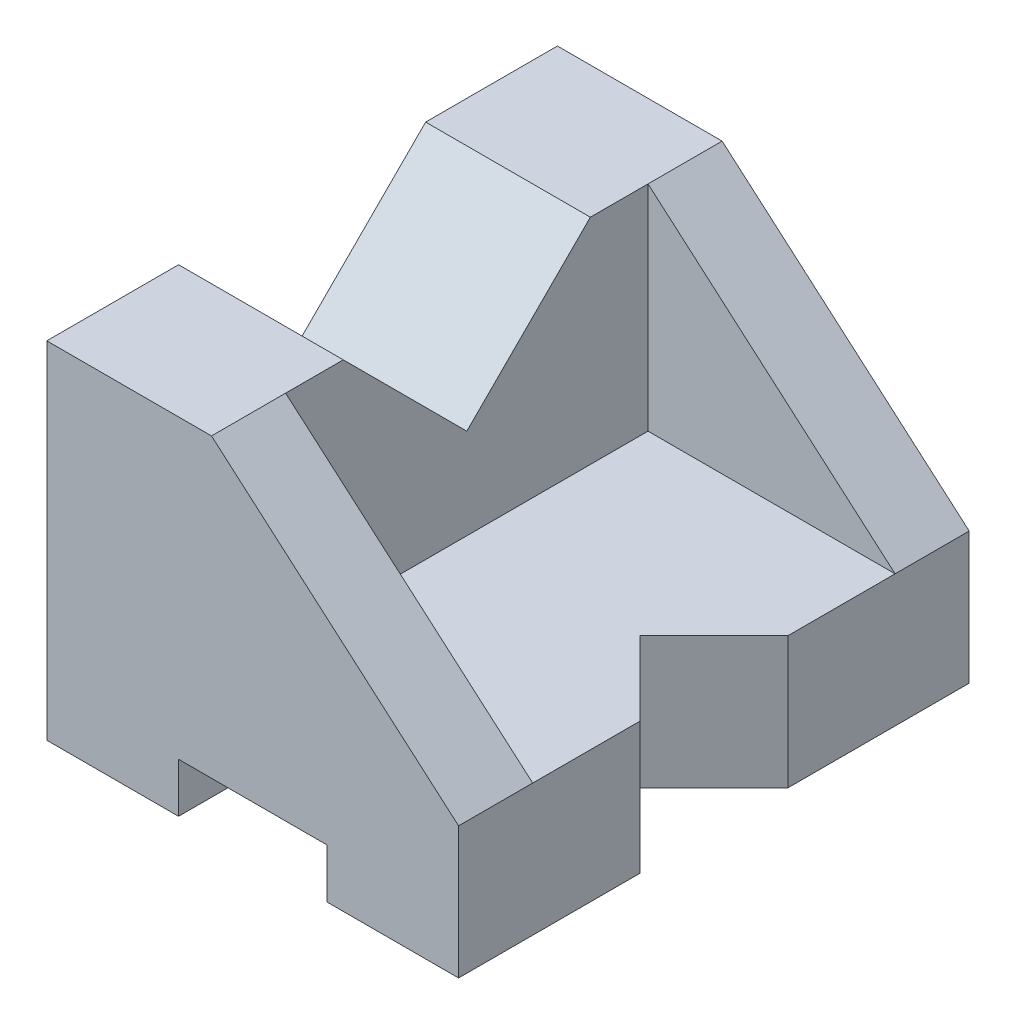
ISO-10303-21;
HEADER;
FILE_DESCRIPTION(('STEP AP214'),'2;1');
FILE_NAME('part.step','',(''),(''),'','','');
FILE_SCHEMA(('AUTOMOTIVE_DESIGN { 1 0 10303 214 1 1 1 1 }'));
ENDSEC;
DATA;
#1=APPLICATION_CONTEXT('core data for automotive mechanical design processes');
#2=APPLICATION_PROTOCOL_DEFINITION('international standard','automotive_design',2000,#1);
#3=PRODUCT_CONTEXT('',#1,'mechanical');
#4=PRODUCT('Part','Part','',(#3));
#5=PRODUCT_RELATED_PRODUCT_CATEGORY('part','',(#4));
#6=PRODUCT_DEFINITION_FORMATION('','',#4);
#7=PRODUCT_DEFINITION_CONTEXT('part definition',#1,'design');
#8=PRODUCT_DEFINITION('design','',#6,#7);
#9=PRODUCT_DEFINITION_SHAPE('','',#8);
#10=(LENGTH_UNIT() NAMED_UNIT(*) SI_UNIT(.MILLI.,.METRE.));
#11=(NAMED_UNIT(*) PLANE_ANGLE_UNIT() SI_UNIT($,.RADIAN.));
#12=(NAMED_UNIT(*) SI_UNIT($,.STERADIAN.) SOLID_ANGLE_UNIT());
#13=UNCERTAINTY_MEASURE_WITH_UNIT(LENGTH_MEASURE(1.E-05),#10,'distance_accuracy_value','');
#14=(GEOMETRIC_REPRESENTATION_CONTEXT(3) GLOBAL_UNCERTAINTY_ASSIGNED_CONTEXT((#13)) GLOBAL_UNIT_ASSIGNED_CONTEXT((#10,
#11,#12)) REPRESENTATION_CONTEXT('',''));
#15=CARTESIAN_POINT('',(0.,0.,0.));
#16=DIRECTION('',(0.,0.,1.));
#17=DIRECTION('',(1.,0.,0.));
#18=AXIS2_PLACEMENT_3D('',#15,#16,#17);
#19=CARTESIAN_POINT('',(25.,0.,31.));
#20=DIRECTION('',(-1.,0.,0.));
#21=DIRECTION('',(0.,-1.,0.));
#22=AXIS2_PLACEMENT_3D('',#19,#20,#21);
#23=PLANE('',#22);
#24=DIRECTION('',(0.,-1.,0.));
#25=VECTOR('',#24,1.);
#26=CARTESIAN_POINT('',(25.,155.055541844904,9.));
#27=LINE('',#26,#25);
#28=CARTESIAN_POINT('',(25.,10.,9.));
#29=VERTEX_POINT('',#28);
#30=CARTESIAN_POINT('',(25.,-6.,9.));
#31=VERTEX_POINT('',#30);
#32=EDGE_CURVE('E178',#29,#31,#27,.T.);
#33=ORIENTED_EDGE('',*,*,#32,.F.);
#34=DIRECTION('',(0.,0.,-1.));
#35=VECTOR('',#34,1.);
#36=CARTESIAN_POINT('',(25.,10.,31.));
#37=LINE('',#36,#35);
#38=CARTESIAN_POINT('',(25.,10.,22.));
#39=VERTEX_POINT('',#38);
#40=EDGE_CURVE('E265',#39,#29,#37,.T.);
#41=ORIENTED_EDGE('',*,*,#40,.F.);
#42=CARTESIAN_POINT('',(25.,10.,31.));
#43=VERTEX_POINT('',#42);
#44=EDGE_CURVE('E262',#43,#39,#37,.T.);
#45=ORIENTED_EDGE('',*,*,#44,.F.);
#46=DIRECTION('',(0.,1.,0.));
#47=VECTOR('',#46,1.);
#48=CARTESIAN_POINT('',(25.,0.,31.));
#49=LINE('',#48,#47);
#50=CARTESIAN_POINT('',(25.,-6.,31.));
#51=VERTEX_POINT('',#50);
#52=EDGE_CURVE('E242',#51,#43,#49,.T.);
#53=ORIENTED_EDGE('',*,*,#52,.F.);
#54=DIRECTION('',(0.,0.,-1.));
#55=VECTOR('',#54,1.);
#56=CARTESIAN_POINT('',(25.,-6.,31.));
#57=LINE('',#56,#55);
#58=EDGE_CURVE('E266',#51,#31,#57,.T.);
#59=ORIENTED_EDGE('',*,*,#58,.T.);
#60=EDGE_LOOP('',(#33,#41,#45,#53,#59));
#61=FACE_BOUND('',#60,.T.);
#62=ADVANCED_FACE('F41',(#61),#23,.F.);
#63=CARTESIAN_POINT('',(0.,10.,31.));
#64=DIRECTION('',(0.,1.,0.));
#65=DIRECTION('',(0.,0.,1.));
#66=AXIS2_PLACEMENT_3D('',#63,#64,#65);
#67=PLANE('',#66);
#68=DIRECTION('',(-0.707106781186548,0.,-0.707106781186547));
#69=VECTOR('',#68,1.);
#70=CARTESIAN_POINT('',(23.5,10.,7.49999999999999));
#71=LINE('',#70,#69);
#72=CARTESIAN_POINT('',(16.,10.,0.));
#73=VERTEX_POINT('',#72);
#74=EDGE_CURVE('E56',#29,#73,#71,.T.);
#75=ORIENTED_EDGE('',*,*,#74,.T.);
#76=DIRECTION('',(0.707106781186548,0.,-0.707106781186548));
#77=VECTOR('',#76,1.);
#78=CARTESIAN_POINT('',(-7.5,10.,23.5));
#79=LINE('',#78,#77);
#80=CARTESIAN_POINT('',(25.,10.,-9.));
#81=VERTEX_POINT('',#80);
#82=EDGE_CURVE('E60',#73,#81,#79,.T.);
#83=ORIENTED_EDGE('',*,*,#82,.T.);
#84=CARTESIAN_POINT('',(25.,10.,-22.));
#85=VERTEX_POINT('',#84);
#86=EDGE_CURVE('E245',#81,#85,#37,.T.);
#87=ORIENTED_EDGE('',*,*,#86,.T.);
#88=DIRECTION('',(1.,0.,0.));
#89=VECTOR('',#88,1.);
#90=CARTESIAN_POINT('',(0.,10.,-22.));
#91=LINE('',#90,#89);
#92=CARTESIAN_POINT('',(-5.,10.,-22.));
#93=VERTEX_POINT('',#92);
#94=EDGE_CURVE('E206',#93,#85,#91,.T.);
#95=ORIENTED_EDGE('',*,*,#94,.F.);
#96=DIRECTION('',(0.,0.,-1.));
#97=VECTOR('',#96,1.);
#98=CARTESIAN_POINT('',(-5.,10.,31.));
#99=LINE('',#98,#97);
#100=CARTESIAN_POINT('',(-5.,10.,22.));
#101=VERTEX_POINT('',#100);
#102=EDGE_CURVE('E291',#101,#93,#99,.T.);
#103=ORIENTED_EDGE('',*,*,#102,.F.);
#104=DIRECTION('',(1.,0.,0.));
#105=VECTOR('',#104,1.);
#106=CARTESIAN_POINT('',(0.,10.,22.));
#107=LINE('',#106,#105);
#108=EDGE_CURVE('E223',#101,#39,#107,.T.);
#109=ORIENTED_EDGE('',*,*,#108,.T.);
#110=ORIENTED_EDGE('',*,*,#40,.T.);
#111=EDGE_LOOP('',(#75,#83,#87,#95,#103,#109,#110));
#112=FACE_BOUND('',#111,.T.);
#113=ADVANCED_FACE('F43',(#112),#67,.T.);
#114=CARTESIAN_POINT('',(0.,-6.,31.));
#115=DIRECTION('',(0.,1.,0.));
#116=DIRECTION('',(-1.,0.,0.));
#117=AXIS2_PLACEMENT_3D('',#114,#115,#116);
#118=PLANE('',#117);
#119=DIRECTION('',(0.707106781186548,0.,-0.707106781186548));
#120=VECTOR('',#119,1.);
#121=CARTESIAN_POINT('',(-7.5,-6.,23.5));
#122=LINE('',#121,#120);
#123=CARTESIAN_POINT('',(16.,-5.99999999999995,0.));
#124=VERTEX_POINT('',#123);
#125=CARTESIAN_POINT('',(25.,-6.,-9.));
#126=VERTEX_POINT('',#125);
#127=EDGE_CURVE('E11',#124,#126,#122,.T.);
#128=ORIENTED_EDGE('',*,*,#127,.F.);
#129=DIRECTION('',(-0.707106781186548,0.,-0.707106781186547));
#130=VECTOR('',#129,1.);
#131=CARTESIAN_POINT('',(23.5,-6.,7.49999999999999));
#132=LINE('',#131,#130);
#133=EDGE_CURVE('E49',#31,#124,#132,.T.);
#134=ORIENTED_EDGE('',*,*,#133,.F.);
#135=ORIENTED_EDGE('',*,*,#58,.F.);
#136=DIRECTION('',(1.,0.,0.));
#137=VECTOR('',#136,1.);
#138=CARTESIAN_POINT('',(0.,-6.,31.));
#139=LINE('',#138,#137);
#140=CARTESIAN_POINT('',(8.99999999999999,-6.,31.));
#141=VERTEX_POINT('',#140);
#142=EDGE_CURVE('E240',#141,#51,#139,.T.);
#143=ORIENTED_EDGE('',*,*,#142,.F.);
#144=DIRECTION('',(0.,0.,-1.));
#145=VECTOR('',#144,1.);
#146=CARTESIAN_POINT('',(8.99999999999999,-6.,31.));
#147=LINE('',#146,#145);
#148=CARTESIAN_POINT('',(8.99999999999999,-6.,-31.));
#149=VERTEX_POINT('',#148);
#150=EDGE_CURVE('E268',#141,#149,#147,.T.);
#151=ORIENTED_EDGE('',*,*,#150,.T.);
#152=DIRECTION('',(1.,0.,0.));
#153=VECTOR('',#152,1.);
#154=CARTESIAN_POINT('',(0.,-6.,-31.));
#155=LINE('',#154,#153);
#156=CARTESIAN_POINT('',(25.,-6.,-31.));
#157=VERTEX_POINT('',#156);
#158=EDGE_CURVE('E258',#149,#157,#155,.T.);
#159=ORIENTED_EDGE('',*,*,#158,.T.);
#160=EDGE_CURVE('E169',#126,#157,#57,.T.);
#161=ORIENTED_EDGE('',*,*,#160,.F.);
#162=EDGE_LOOP('',(#128,#134,#135,#143,#151,#159,#161));
#163=FACE_BOUND('',#162,.T.);
#164=ADVANCED_FACE('F165',(#163),#118,.F.);
#165=CARTESIAN_POINT('',(0.,36.,31.));
#166=DIRECTION('',(0.,-1.,0.));
#167=DIRECTION('',(0.,0.,-1.));
#168=AXIS2_PLACEMENT_3D('',#165,#166,#167);
#169=PLANE('',#168);
#170=DIRECTION('',(-1.,0.,0.));
#171=VECTOR('',#170,1.);
#172=CARTESIAN_POINT('',(107.555541844904,36.,-15.));
#173=LINE('',#172,#171);
#174=CARTESIAN_POINT('',(-5.,36.,-15.));
#175=VERTEX_POINT('',#174);
#176=CARTESIAN_POINT('',(-25.,36.,-15.));
#177=VERTEX_POINT('',#176);
#178=EDGE_CURVE('E189',#175,#177,#173,.T.);
#179=ORIENTED_EDGE('',*,*,#178,.F.);
#180=DIRECTION('',(0.,0.,-1.));
#181=VECTOR('',#180,1.);
#182=CARTESIAN_POINT('',(-5.,36.,31.));
#183=LINE('',#182,#181);
#184=CARTESIAN_POINT('',(-5.,36.,-22.));
#185=VERTEX_POINT('',#184);
#186=EDGE_CURVE('E287',#175,#185,#183,.T.);
#187=ORIENTED_EDGE('',*,*,#186,.T.);
#188=DIRECTION('',(0.,0.,1.));
#189=VECTOR('',#188,1.);
#190=CARTESIAN_POINT('',(-5.,36.,-31.));
#191=LINE('',#190,#189);
#192=CARTESIAN_POINT('',(-5.,36.,-31.));
#193=VERTEX_POINT('',#192);
#194=EDGE_CURVE('E211',#193,#185,#191,.T.);
#195=ORIENTED_EDGE('',*,*,#194,.F.);
#196=DIRECTION('',(-1.,0.,0.));
#197=VECTOR('',#196,1.);
#198=CARTESIAN_POINT('',(0.,36.,-31.));
#199=LINE('',#198,#197);
#200=CARTESIAN_POINT('',(-25.,36.,-31.));
#201=VERTEX_POINT('',#200);
#202=EDGE_CURVE('E220',#193,#201,#199,.T.);
#203=ORIENTED_EDGE('',*,*,#202,.T.);
#204=DIRECTION('',(0.,0.,-1.));
#205=VECTOR('',#204,1.);
#206=CARTESIAN_POINT('',(-25.,36.,31.));
#207=LINE('',#206,#205);
#208=EDGE_CURVE('E283',#177,#201,#207,.T.);
#209=ORIENTED_EDGE('',*,*,#208,.F.);
#210=EDGE_LOOP('',(#179,#187,#195,#203,#209));
#211=FACE_BOUND('',#210,.T.);
#212=ADVANCED_FACE('F314',(#211),#169,.F.);
#213=CARTESIAN_POINT('',(-5.,0.,31.));
#214=DIRECTION('',(1.,0.,0.));
#215=DIRECTION('',(0.,1.,0.));
#216=AXIS2_PLACEMENT_3D('',#213,#214,#215);
#217=PLANE('',#216);
#218=DIRECTION('',(0.,-0.707106781186548,0.707106781186548));
#219=VECTOR('',#218,1.);
#220=CARTESIAN_POINT('',(-4.99999999999999,-5.,26.));
#221=LINE('',#220,#219);
#222=CARTESIAN_POINT('',(-5.,21.,0.));
#223=VERTEX_POINT('',#222);
#224=EDGE_CURVE('E196',#175,#223,#221,.T.);
#225=ORIENTED_EDGE('',*,*,#224,.T.);
#226=DIRECTION('',(0.,0.707106781186548,0.707106781186548));
#227=VECTOR('',#226,1.);
#228=CARTESIAN_POINT('',(-5.,26.,5.));
#229=LINE('',#228,#227);
#230=CARTESIAN_POINT('',(-5.,36.,15.));
#231=VERTEX_POINT('',#230);
#232=EDGE_CURVE('E198',#223,#231,#229,.T.);
#233=ORIENTED_EDGE('',*,*,#232,.T.);
#234=CARTESIAN_POINT('',(-5.,36.,22.));
#235=VERTEX_POINT('',#234);
#236=EDGE_CURVE('E292',#235,#231,#183,.T.);
#237=ORIENTED_EDGE('',*,*,#236,.F.);
#238=DIRECTION('',(0.,-1.,0.));
#239=VECTOR('',#238,1.);
#240=CARTESIAN_POINT('',(-5.,0.,22.));
#241=LINE('',#240,#239);
#242=EDGE_CURVE('E214',#235,#101,#241,.T.);
#243=ORIENTED_EDGE('',*,*,#242,.T.);
#244=ORIENTED_EDGE('',*,*,#102,.T.);
#245=DIRECTION('',(0.,-1.,0.));
#246=VECTOR('',#245,1.);
#247=CARTESIAN_POINT('',(-5.,0.,-22.));
#248=LINE('',#247,#246);
#249=EDGE_CURVE('E200',#185,#93,#248,.T.);
#250=ORIENTED_EDGE('',*,*,#249,.F.);
#251=ORIENTED_EDGE('',*,*,#186,.F.);
#252=EDGE_LOOP('',(#225,#233,#237,#243,#244,#250,#251));
#253=FACE_BOUND('',#252,.T.);
#254=ADVANCED_FACE('F318',(#253),#217,.T.);
#255=CARTESIAN_POINT('',(-25.,0.,31.));
#256=DIRECTION('',(1.,0.,0.));
#257=DIRECTION('',(0.,1.,0.));
#258=AXIS2_PLACEMENT_3D('',#255,#256,#257);
#259=PLANE('',#258);
#260=DIRECTION('',(0.,0.707106781186548,0.707106781186548));
#261=VECTOR('',#260,1.);
#262=CARTESIAN_POINT('',(-25.,26.,5.));
#263=LINE('',#262,#261);
#264=CARTESIAN_POINT('',(-25.,21.,0.));
#265=VERTEX_POINT('',#264);
#266=CARTESIAN_POINT('',(-25.,36.,15.));
#267=VERTEX_POINT('',#266);
#268=EDGE_CURVE('E179',#265,#267,#263,.T.);
#269=ORIENTED_EDGE('',*,*,#268,.F.);
#270=DIRECTION('',(0.,-0.707106781186548,0.707106781186548));
#271=VECTOR('',#270,1.);
#272=CARTESIAN_POINT('',(-25.,-5.,26.));
#273=LINE('',#272,#271);
#274=EDGE_CURVE('E295',#177,#265,#273,.T.);
#275=ORIENTED_EDGE('',*,*,#274,.F.);
#276=ORIENTED_EDGE('',*,*,#208,.T.);
#277=DIRECTION('',(0.,-1.,0.));
#278=VECTOR('',#277,1.);
#279=CARTESIAN_POINT('',(-25.,0.,-31.));
#280=LINE('',#279,#278);
#281=CARTESIAN_POINT('',(-25.,-6.,-31.));
#282=VERTEX_POINT('',#281);
#283=EDGE_CURVE('E248',#201,#282,#280,.T.);
#284=ORIENTED_EDGE('',*,*,#283,.T.);
#285=DIRECTION('',(0.,0.,-1.));
#286=VECTOR('',#285,1.);
#287=CARTESIAN_POINT('',(-25.,-6.,31.));
#288=LINE('',#287,#286);
#289=CARTESIAN_POINT('',(-25.,-6.,31.));
#290=VERTEX_POINT('',#289);
#291=EDGE_CURVE('E280',#290,#282,#288,.T.);
#292=ORIENTED_EDGE('',*,*,#291,.F.);
#293=DIRECTION('',(0.,-1.,0.));
#294=VECTOR('',#293,1.);
#295=CARTESIAN_POINT('',(-25.,0.,31.));
#296=LINE('',#295,#294);
#297=CARTESIAN_POINT('',(-25.,36.,31.));
#298=VERTEX_POINT('',#297);
#299=EDGE_CURVE('E229',#298,#290,#296,.T.);
#300=ORIENTED_EDGE('',*,*,#299,.F.);
#301=EDGE_CURVE('E284',#298,#267,#207,.T.);
#302=ORIENTED_EDGE('',*,*,#301,.T.);
#303=EDGE_LOOP('',(#269,#275,#276,#284,#292,#300,#302));
#304=FACE_BOUND('',#303,.T.);
#305=ADVANCED_FACE('F305',(#304),#259,.F.);
#306=ORIENTED_EDGE('',*,*,#236,.T.);
#307=DIRECTION('',(-1.,0.,0.));
#308=VECTOR('',#307,1.);
#309=CARTESIAN_POINT('',(107.555541844904,36.,15.));
#310=LINE('',#309,#308);
#311=EDGE_CURVE('E192',#231,#267,#310,.T.);
#312=ORIENTED_EDGE('',*,*,#311,.T.);
#313=ORIENTED_EDGE('',*,*,#301,.F.);
#314=DIRECTION('',(-1.,0.,0.));
#315=VECTOR('',#314,1.);
#316=CARTESIAN_POINT('',(0.,36.,31.));
#317=LINE('',#316,#315);
#318=CARTESIAN_POINT('',(-5.,36.,31.));
#319=VERTEX_POINT('',#318);
#320=EDGE_CURVE('E227',#319,#298,#317,.T.);
#321=ORIENTED_EDGE('',*,*,#320,.F.);
#322=EDGE_CURVE('E288',#319,#235,#183,.T.);
#323=ORIENTED_EDGE('',*,*,#322,.T.);
#324=EDGE_LOOP('',(#306,#312,#313,#321,#323));
#325=FACE_BOUND('',#324,.T.);
#326=ADVANCED_FACE('F321',(#325),#169,.F.);
#327=CARTESIAN_POINT('',(0.,-6.,31.));
#328=DIRECTION('',(0.,1.,0.));
#329=DIRECTION('',(-1.,0.,0.));
#330=AXIS2_PLACEMENT_3D('',#327,#328,#329);
#331=PLANE('',#330);
#332=DIRECTION('',(1.,0.,0.));
#333=VECTOR('',#332,1.);
#334=CARTESIAN_POINT('',(0.,-6.,-31.));
#335=LINE('',#334,#333);
#336=CARTESIAN_POINT('',(-9.,-6.,-31.));
#337=VERTEX_POINT('',#336);
#338=EDGE_CURVE('E250',#282,#337,#335,.T.);
#339=ORIENTED_EDGE('',*,*,#338,.T.);
#340=DIRECTION('',(0.,0.,-1.));
#341=VECTOR('',#340,1.);
#342=CARTESIAN_POINT('',(-9.,-6.,31.));
#343=LINE('',#342,#341);
#344=CARTESIAN_POINT('',(-9.,-6.,31.));
#345=VERTEX_POINT('',#344);
#346=EDGE_CURVE('E277',#345,#337,#343,.T.);
#347=ORIENTED_EDGE('',*,*,#346,.F.);
#348=DIRECTION('',(1.,0.,0.));
#349=VECTOR('',#348,1.);
#350=CARTESIAN_POINT('',(0.,-6.,31.));
#351=LINE('',#350,#349);
#352=EDGE_CURVE('E232',#290,#345,#351,.T.);
#353=ORIENTED_EDGE('',*,*,#352,.F.);
#354=ORIENTED_EDGE('',*,*,#291,.T.);
#355=EDGE_LOOP('',(#339,#347,#353,#354));
#356=FACE_BOUND('',#355,.T.);
#357=ADVANCED_FACE('F361',(#356),#331,.F.);
#358=CARTESIAN_POINT('',(-8.99999999999999,0.,31.));
#359=DIRECTION('',(-1.,0.,0.));
#360=DIRECTION('',(0.,-1.,0.));
#361=AXIS2_PLACEMENT_3D('',#358,#359,#360);
#362=PLANE('',#361);
#363=DIRECTION('',(0.,1.,0.));
#364=VECTOR('',#363,1.);
#365=CARTESIAN_POINT('',(-8.99999999999999,0.,-31.));
#366=LINE('',#365,#364);
#367=CARTESIAN_POINT('',(-8.99999999999999,0.,-31.));
#368=VERTEX_POINT('',#367);
#369=EDGE_CURVE('E252',#337,#368,#366,.T.);
#370=ORIENTED_EDGE('',*,*,#369,.T.);
#371=DIRECTION('',(0.,0.,-1.));
#372=VECTOR('',#371,1.);
#373=CARTESIAN_POINT('',(-8.99999999999999,0.,31.));
#374=LINE('',#373,#372);
#375=CARTESIAN_POINT('',(-8.99999999999999,0.,31.));
#376=VERTEX_POINT('',#375);
#377=EDGE_CURVE('E274',#376,#368,#374,.T.);
#378=ORIENTED_EDGE('',*,*,#377,.F.);
#379=DIRECTION('',(0.,1.,0.));
#380=VECTOR('',#379,1.);
#381=CARTESIAN_POINT('',(-8.99999999999999,0.,31.));
#382=LINE('',#381,#380);
#383=EDGE_CURVE('E234',#345,#376,#382,.T.);
#384=ORIENTED_EDGE('',*,*,#383,.F.);
#385=ORIENTED_EDGE('',*,*,#346,.T.);
#386=EDGE_LOOP('',(#370,#378,#384,#385));
#387=FACE_BOUND('',#386,.T.);
#388=ADVANCED_FACE('F368',(#387),#362,.F.);
#389=CARTESIAN_POINT('',(0.,0.,31.));
#390=DIRECTION('',(0.,1.,0.));
#391=DIRECTION('',(0.,0.,1.));
#392=AXIS2_PLACEMENT_3D('',#389,#390,#391);
#393=PLANE('',#392);
#394=DIRECTION('',(1.,0.,0.));
#395=VECTOR('',#394,1.);
#396=CARTESIAN_POINT('',(0.,0.,-31.));
#397=LINE('',#396,#395);
#398=CARTESIAN_POINT('',(8.99999999999999,0.,-31.));
#399=VERTEX_POINT('',#398);
#400=EDGE_CURVE('E254',#368,#399,#397,.T.);
#401=ORIENTED_EDGE('',*,*,#400,.T.);
#402=DIRECTION('',(0.,0.,-1.));
#403=VECTOR('',#402,1.);
#404=CARTESIAN_POINT('',(8.99999999999999,0.,31.));
#405=LINE('',#404,#403);
#406=CARTESIAN_POINT('',(8.99999999999999,0.,31.));
#407=VERTEX_POINT('',#406);
#408=EDGE_CURVE('E271',#407,#399,#405,.T.);
#409=ORIENTED_EDGE('',*,*,#408,.F.);
#410=DIRECTION('',(1.,0.,0.));
#411=VECTOR('',#410,1.);
#412=CARTESIAN_POINT('',(0.,0.,31.));
#413=LINE('',#412,#411);
#414=EDGE_CURVE('E236',#376,#407,#413,.T.);
#415=ORIENTED_EDGE('',*,*,#414,.F.);
#416=ORIENTED_EDGE('',*,*,#377,.T.);
#417=EDGE_LOOP('',(#401,#409,#415,#416));
#418=FACE_BOUND('',#417,.T.);
#419=ADVANCED_FACE('F371',(#418),#393,.F.);
#420=CARTESIAN_POINT('',(8.99999999999999,0.,31.));
#421=DIRECTION('',(1.,0.,0.));
#422=DIRECTION('',(0.,1.,0.));
#423=AXIS2_PLACEMENT_3D('',#420,#421,#422);
#424=PLANE('',#423);
#425=DIRECTION('',(0.,-1.,0.));
#426=VECTOR('',#425,1.);
#427=CARTESIAN_POINT('',(8.99999999999999,0.,-31.));
#428=LINE('',#427,#426);
#429=EDGE_CURVE('E256',#399,#149,#428,.T.);
#430=ORIENTED_EDGE('',*,*,#429,.T.);
#431=ORIENTED_EDGE('',*,*,#150,.F.);
#432=DIRECTION('',(0.,-1.,0.));
#433=VECTOR('',#432,1.);
#434=CARTESIAN_POINT('',(8.99999999999999,0.,31.));
#435=LINE('',#434,#433);
#436=EDGE_CURVE('E238',#407,#141,#435,.T.);
#437=ORIENTED_EDGE('',*,*,#436,.F.);
#438=ORIENTED_EDGE('',*,*,#408,.T.);
#439=EDGE_LOOP('',(#430,#431,#437,#438));
#440=FACE_BOUND('',#439,.T.);
#441=ADVANCED_FACE('F373',(#440),#424,.F.);
#442=ORIENTED_EDGE('',*,*,#86,.F.);
#443=DIRECTION('',(0.,-1.,0.));
#444=VECTOR('',#443,1.);
#445=CARTESIAN_POINT('',(25.,155.055541844904,-9.));
#446=LINE('',#445,#444);
#447=EDGE_CURVE('E182',#81,#126,#446,.T.);
#448=ORIENTED_EDGE('',*,*,#447,.T.);
#449=ORIENTED_EDGE('',*,*,#160,.T.);
#450=DIRECTION('',(0.,1.,0.));
#451=VECTOR('',#450,1.);
#452=CARTESIAN_POINT('',(25.,0.,-31.));
#453=LINE('',#452,#451);
#454=CARTESIAN_POINT('',(25.,10.,-31.));
#455=VERTEX_POINT('',#454);
#456=EDGE_CURVE('E230',#157,#455,#453,.T.);
#457=ORIENTED_EDGE('',*,*,#456,.T.);
#458=DIRECTION('',(0.,0.,1.));
#459=VECTOR('',#458,1.);
#460=CARTESIAN_POINT('',(25.,10.,-31.));
#461=LINE('',#460,#459);
#462=EDGE_CURVE('E203',#455,#85,#461,.T.);
#463=ORIENTED_EDGE('',*,*,#462,.T.);
#464=EDGE_LOOP('',(#442,#448,#449,#457,#463));
#465=FACE_BOUND('',#464,.T.);
#466=ADVANCED_FACE('F348',(#465),#23,.F.);
#467=CARTESIAN_POINT('',(0.,0.,31.));
#468=DIRECTION('',(0.,0.,1.));
#469=DIRECTION('',(1.,0.,0.));
#470=AXIS2_PLACEMENT_3D('',#467,#468,#469);
#471=PLANE('',#470);
#472=ORIENTED_EDGE('',*,*,#52,.T.);
#473=DIRECTION('',(-0.755689082789818,0.654930538417842,0.));
#474=VECTOR('',#473,1.);
#475=CARTESIAN_POINT('',(15.6725888324873,18.0837563451777,31.));
#476=LINE('',#475,#474);
#477=EDGE_CURVE('E217',#43,#319,#476,.T.);
#478=ORIENTED_EDGE('',*,*,#477,.T.);
#479=ORIENTED_EDGE('',*,*,#320,.T.);
#480=ORIENTED_EDGE('',*,*,#299,.T.);
#481=ORIENTED_EDGE('',*,*,#352,.T.);
#482=ORIENTED_EDGE('',*,*,#383,.T.);
#483=ORIENTED_EDGE('',*,*,#414,.T.);
#484=ORIENTED_EDGE('',*,*,#436,.T.);
#485=ORIENTED_EDGE('',*,*,#142,.T.);
#486=EDGE_LOOP('',(#472,#478,#479,#480,#481,#482,#483,#484,#485));
#487=FACE_BOUND('',#486,.T.);
#488=ADVANCED_FACE('F337',(#487),#471,.T.);
#489=CARTESIAN_POINT('',(0.,0.,-31.));
#490=DIRECTION('',(0.,0.,1.));
#491=DIRECTION('',(1.,0.,0.));
#492=AXIS2_PLACEMENT_3D('',#489,#490,#491);
#493=PLANE('',#492);
#494=ORIENTED_EDGE('',*,*,#202,.F.);
#495=DIRECTION('',(-0.755689082789818,0.654930538417842,0.));
#496=VECTOR('',#495,1.);
#497=CARTESIAN_POINT('',(15.6725888324873,18.0837563451777,-31.));
#498=LINE('',#497,#496);
#499=EDGE_CURVE('E201',#455,#193,#498,.T.);
#500=ORIENTED_EDGE('',*,*,#499,.F.);
#501=ORIENTED_EDGE('',*,*,#456,.F.);
#502=ORIENTED_EDGE('',*,*,#158,.F.);
#503=ORIENTED_EDGE('',*,*,#429,.F.);
#504=ORIENTED_EDGE('',*,*,#400,.F.);
#505=ORIENTED_EDGE('',*,*,#369,.F.);
#506=ORIENTED_EDGE('',*,*,#338,.F.);
#507=ORIENTED_EDGE('',*,*,#283,.F.);
#508=EDGE_LOOP('',(#494,#500,#501,#502,#503,#504,#505,#506,#507));
#509=FACE_BOUND('',#508,.T.);
#510=ADVANCED_FACE('F353',(#509),#493,.F.);
#511=CARTESIAN_POINT('',(15.6725888324873,18.0837563451777,31.));
#512=DIRECTION('',(-0.654930538417842,-0.755689082789818,0.));
#513=DIRECTION('',(0.755689082789818,-0.654930538417842,0.));
#514=AXIS2_PLACEMENT_3D('',#511,#512,#513);
#515=PLANE('',#514);
#516=DIRECTION('',(-0.755689082789818,0.654930538417842,0.));
#517=VECTOR('',#516,1.);
#518=CARTESIAN_POINT('',(15.6725888324873,18.0837563451777,22.));
#519=LINE('',#518,#517);
#520=EDGE_CURVE('E221',#39,#235,#519,.T.);
#521=ORIENTED_EDGE('',*,*,#520,.T.);
#522=ORIENTED_EDGE('',*,*,#322,.F.);
#523=ORIENTED_EDGE('',*,*,#477,.F.);
#524=ORIENTED_EDGE('',*,*,#44,.T.);
#525=EDGE_LOOP('',(#521,#522,#523,#524));
#526=FACE_BOUND('',#525,.T.);
#527=ADVANCED_FACE('F332',(#526),#515,.F.);
#528=CARTESIAN_POINT('',(0.,0.,22.));
#529=DIRECTION('',(0.,0.,1.));
#530=DIRECTION('',(1.,0.,0.));
#531=AXIS2_PLACEMENT_3D('',#528,#529,#530);
#532=PLANE('',#531);
#533=ORIENTED_EDGE('',*,*,#242,.F.);
#534=ORIENTED_EDGE('',*,*,#520,.F.);
#535=ORIENTED_EDGE('',*,*,#108,.F.);
#536=EDGE_LOOP('',(#533,#534,#535));
#537=FACE_BOUND('',#536,.T.);
#538=ADVANCED_FACE('F330',(#537),#532,.F.);
#539=CARTESIAN_POINT('',(15.6725888324873,18.0837563451777,-31.));
#540=DIRECTION('',(0.654930538417842,0.755689082789818,0.));
#541=DIRECTION('',(-0.755689082789818,0.654930538417842,0.));
#542=AXIS2_PLACEMENT_3D('',#539,#540,#541);
#543=PLANE('',#542);
#544=DIRECTION('',(-0.755689082789818,0.654930538417842,0.));
#545=VECTOR('',#544,1.);
#546=CARTESIAN_POINT('',(15.6725888324873,18.0837563451777,-22.));
#547=LINE('',#546,#545);
#548=EDGE_CURVE('E204',#85,#185,#547,.T.);
#549=ORIENTED_EDGE('',*,*,#548,.F.);
#550=ORIENTED_EDGE('',*,*,#462,.F.);
#551=ORIENTED_EDGE('',*,*,#499,.T.);
#552=ORIENTED_EDGE('',*,*,#194,.T.);
#553=EDGE_LOOP('',(#549,#550,#551,#552));
#554=FACE_BOUND('',#553,.T.);
#555=ADVANCED_FACE('F347',(#554),#543,.T.);
#556=CARTESIAN_POINT('',(0.,0.,-22.));
#557=DIRECTION('',(0.,0.,1.));
#558=DIRECTION('',(1.,0.,0.));
#559=AXIS2_PLACEMENT_3D('',#556,#557,#558);
#560=PLANE('',#559);
#561=ORIENTED_EDGE('',*,*,#249,.T.);
#562=ORIENTED_EDGE('',*,*,#94,.T.);
#563=ORIENTED_EDGE('',*,*,#548,.T.);
#564=EDGE_LOOP('',(#561,#562,#563));
#565=FACE_BOUND('',#564,.T.);
#566=ADVANCED_FACE('F344',(#565),#560,.T.);
#567=CARTESIAN_POINT('',(107.555541844904,36.,15.));
#568=DIRECTION('',(0.,0.707106781186547,-0.707106781186547));
#569=DIRECTION('',(0.,0.707106781186548,0.707106781186548));
#570=AXIS2_PLACEMENT_3D('',#567,#568,#569);
#571=PLANE('',#570);
#572=ORIENTED_EDGE('',*,*,#232,.F.);
#573=DIRECTION('',(-1.,0.,0.));
#574=VECTOR('',#573,1.);
#575=CARTESIAN_POINT('',(107.555541844904,21.,0.));
#576=LINE('',#575,#574);
#577=EDGE_CURVE('E188',#223,#265,#576,.T.);
#578=ORIENTED_EDGE('',*,*,#577,.T.);
#579=ORIENTED_EDGE('',*,*,#268,.T.);
#580=ORIENTED_EDGE('',*,*,#311,.F.);
#581=EDGE_LOOP('',(#572,#578,#579,#580));
#582=FACE_BOUND('',#581,.T.);
#583=ADVANCED_FACE('F302',(#582),#571,.T.);
#584=CARTESIAN_POINT('',(107.555541844904,21.,0.));
#585=DIRECTION('',(0.,0.707106781186547,0.707106781186547));
#586=DIRECTION('',(0.,-0.707106781186548,0.707106781186548));
#587=AXIS2_PLACEMENT_3D('',#584,#585,#586);
#588=PLANE('',#587);
#589=ORIENTED_EDGE('',*,*,#224,.F.);
#590=ORIENTED_EDGE('',*,*,#178,.T.);
#591=ORIENTED_EDGE('',*,*,#274,.T.);
#592=ORIENTED_EDGE('',*,*,#577,.F.);
#593=EDGE_LOOP('',(#589,#590,#591,#592));
#594=FACE_BOUND('',#593,.T.);
#595=ADVANCED_FACE('F311',(#594),#588,.T.);
#596=CARTESIAN_POINT('',(25.,155.055541844904,-9.));
#597=DIRECTION('',(0.707106781186547,0.,0.707106781186547));
#598=DIRECTION('',(0.707106781186548,0.,-0.707106781186548));
#599=AXIS2_PLACEMENT_3D('',#596,#597,#598);
#600=PLANE('',#599);
#601=ORIENTED_EDGE('',*,*,#82,.F.);
#602=DIRECTION('',(0.,-1.,0.));
#603=VECTOR('',#602,1.);
#604=CARTESIAN_POINT('',(16.,155.055541844904,0.));
#605=LINE('',#604,#603);
#606=EDGE_CURVE('E177',#73,#124,#605,.T.);
#607=ORIENTED_EDGE('',*,*,#606,.T.);
#608=ORIENTED_EDGE('',*,*,#127,.T.);
#609=ORIENTED_EDGE('',*,*,#447,.F.);
#610=EDGE_LOOP('',(#601,#607,#608,#609));
#611=FACE_BOUND('',#610,.T.);
#612=ADVANCED_FACE('F180',(#611),#600,.T.);
#613=CARTESIAN_POINT('',(16.,155.055541844904,0.));
#614=DIRECTION('',(0.707106781186547,0.,-0.707106781186548));
#615=DIRECTION('',(-0.707106781186548,0.,-0.707106781186547));
#616=AXIS2_PLACEMENT_3D('',#613,#614,#615);
#617=PLANE('',#616);
#618=ORIENTED_EDGE('',*,*,#74,.F.);
#619=ORIENTED_EDGE('',*,*,#32,.T.);
#620=ORIENTED_EDGE('',*,*,#133,.T.);
#621=ORIENTED_EDGE('',*,*,#606,.F.);
#622=EDGE_LOOP('',(#618,#619,#620,#621));
#623=FACE_BOUND('',#622,.T.);
#624=ADVANCED_FACE('F176',(#623),#617,.T.);
#625=CLOSED_SHELL('',(#62,#113,#164,#212,#254,#305,#326,#357,#388,#419,#441,#466,#488,#510,#527,
#538,#555,#566,#583,#595,#612,#624));
#626=MANIFOLD_SOLID_BREP('B2',#625);
#627=ADVANCED_BREP_SHAPE_REPRESENTATION('',(#18,#626),#14);
#628=SHAPE_DEFINITION_REPRESENTATION(#9,#627);
ENDSEC;
END-ISO-10303-21;
